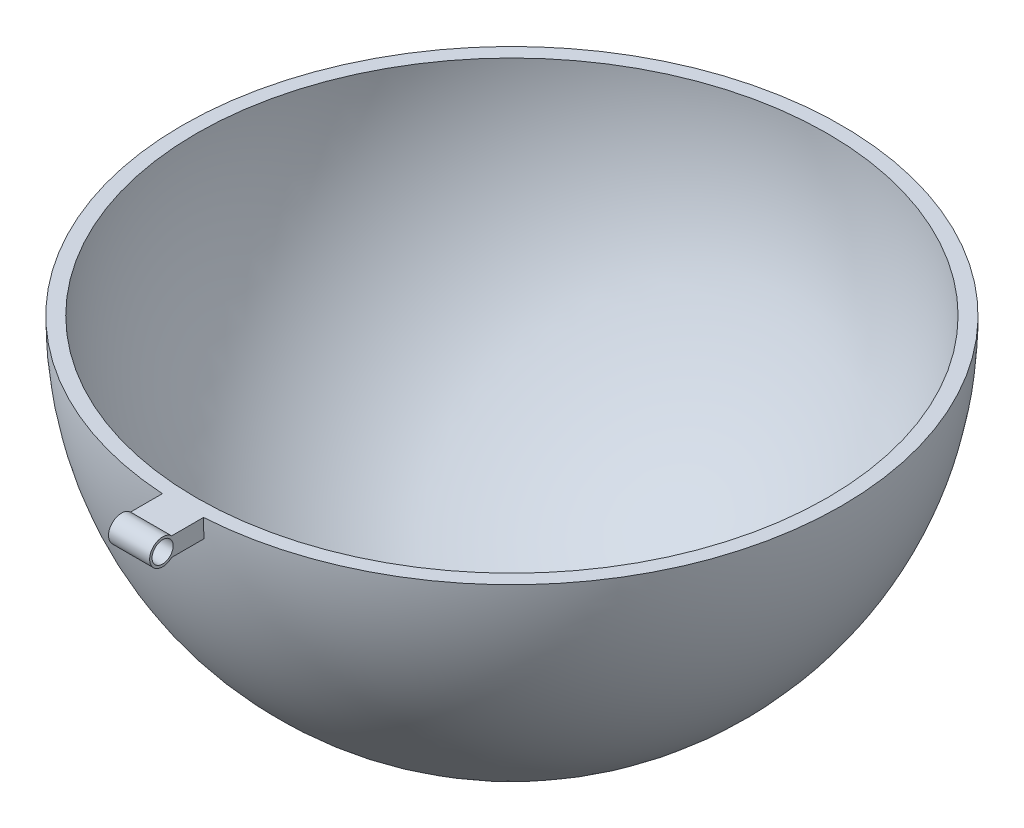
ISO-10303-21;
HEADER;
FILE_DESCRIPTION(('STEP AP214'),'2;1');
FILE_NAME('part.step','',(''),(''),'','','');
FILE_SCHEMA(('AUTOMOTIVE_DESIGN { 1 0 10303 214 1 1 1 1 }'));
ENDSEC;
DATA;
#1=APPLICATION_CONTEXT('core data for automotive mechanical design processes');
#2=APPLICATION_PROTOCOL_DEFINITION('international standard','automotive_design',2000,#1);
#3=PRODUCT_CONTEXT('',#1,'mechanical');
#4=PRODUCT('Part','Part','',(#3));
#5=PRODUCT_RELATED_PRODUCT_CATEGORY('part','',(#4));
#6=PRODUCT_DEFINITION_FORMATION('','',#4);
#7=PRODUCT_DEFINITION_CONTEXT('part definition',#1,'design');
#8=PRODUCT_DEFINITION('design','',#6,#7);
#9=PRODUCT_DEFINITION_SHAPE('','',#8);
#10=(LENGTH_UNIT() NAMED_UNIT(*) SI_UNIT(.MILLI.,.METRE.));
#11=(NAMED_UNIT(*) PLANE_ANGLE_UNIT() SI_UNIT($,.RADIAN.));
#12=(NAMED_UNIT(*) SI_UNIT($,.STERADIAN.) SOLID_ANGLE_UNIT());
#13=UNCERTAINTY_MEASURE_WITH_UNIT(LENGTH_MEASURE(1.E-05),#10,'distance_accuracy_value','');
#14=(GEOMETRIC_REPRESENTATION_CONTEXT(3) GLOBAL_UNCERTAINTY_ASSIGNED_CONTEXT((#13)) GLOBAL_UNIT_ASSIGNED_CONTEXT((#10,
#11,#12)) REPRESENTATION_CONTEXT('',''));
#15=CARTESIAN_POINT('',(0.,0.,0.));
#16=DIRECTION('',(0.,0.,1.));
#17=DIRECTION('',(1.,0.,0.));
#18=AXIS2_PLACEMENT_3D('',#15,#16,#17);
#19=CARTESIAN_POINT('',(0.,0.,0.));
#20=DIRECTION('',(-1.,0.,0.));
#21=DIRECTION('',(0.,0.,1.));
#22=AXIS2_PLACEMENT_3D('',#19,#20,#21);
#23=SPHERICAL_SURFACE('',#22,79.375);
#24=CARTESIAN_POINT('',(4.953,0.,0.));
#25=DIRECTION('',(1.,0.,0.));
#26=DIRECTION('',(0.,0.,-1.));
#27=AXIS2_PLACEMENT_3D('',#24,#25,#26);
#28=CIRCLE('',#27,79.2203156772302);
#29=CARTESIAN_POINT('',(4.953,-4.50836780584041,79.0919277532623));
#30=VERTEX_POINT('',#29);
#31=CARTESIAN_POINT('',(4.953,-3.25980566302915E-13,79.2203156772302));
#32=VERTEX_POINT('',#31);
#33=EDGE_CURVE('E80',#30,#32,#28,.F.);
#34=ORIENTED_EDGE('',*,*,#33,.F.);
#35=CARTESIAN_POINT('',(0.,-4.5083678058404,0.));
#36=DIRECTION('',(0.,1.,0.));
#37=DIRECTION('',(0.,0.,1.));
#38=AXIS2_PLACEMENT_3D('',#35,#36,#37);
#39=CIRCLE('',#38,79.2468626806592);
#40=CARTESIAN_POINT('',(-4.953,-4.50836780584041,79.0919277532623));
#41=VERTEX_POINT('',#40);
#42=EDGE_CURVE('E11',#30,#41,#39,.F.);
#43=ORIENTED_EDGE('',*,*,#42,.T.);
#44=CARTESIAN_POINT('',(-4.953,0.,0.));
#45=DIRECTION('',(1.,0.,0.));
#46=DIRECTION('',(0.,0.,-1.));
#47=AXIS2_PLACEMENT_3D('',#44,#45,#46);
#48=CIRCLE('',#47,79.2203156772302);
#49=CARTESIAN_POINT('',(-4.953,-3.25980566302915E-13,79.2203156772302));
#50=VERTEX_POINT('',#49);
#51=EDGE_CURVE('E92',#41,#50,#48,.F.);
#52=ORIENTED_EDGE('',*,*,#51,.T.);
#53=CARTESIAN_POINT('',(0.,0.,0.));
#54=DIRECTION('',(0.,-1.,0.));
#55=DIRECTION('',(0.,0.,-1.));
#56=AXIS2_PLACEMENT_3D('',#53,#54,#55);
#57=CIRCLE('',#56,79.375);
#58=EDGE_CURVE('E110',#50,#32,#57,.T.);
#59=ORIENTED_EDGE('',*,*,#58,.T.);
#60=EDGE_LOOP('',(#34,#43,#52,#59));
#61=FACE_BOUND('',#60,.T.);
#62=ADVANCED_FACE('F33',(#61),#23,.T.);
#63=CARTESIAN_POINT('',(0.,0.,0.));
#64=DIRECTION('',(-1.,0.,0.));
#65=DIRECTION('',(0.,0.,-1.));
#66=AXIS2_PLACEMENT_3D('',#63,#64,#65);
#67=SPHERICAL_SURFACE('',#66,75.9775973446225);
#68=CARTESIAN_POINT('',(0.,0.,0.));
#69=DIRECTION('',(0.,1.,0.));
#70=DIRECTION('',(0.,0.,-1.));
#71=AXIS2_PLACEMENT_3D('',#68,#69,#70);
#72=SPHERICAL_SURFACE('',#71,75.9775973446225);
#73=CARTESIAN_POINT('',(0.,0.,0.));
#74=DIRECTION('',(0.,1.,0.));
#75=DIRECTION('',(0.,0.,-1.));
#76=AXIS2_PLACEMENT_3D('',#73,#74,#75);
#77=CIRCLE('',#76,75.9775973446225);
#78=CARTESIAN_POINT('',(0.,5.30548726597774E-13,-75.9775973446225));
#79=VERTEX_POINT('',#78);
#80=EDGE_CURVE('E41',#79,#79,#77,.T.);
#81=ORIENTED_EDGE('',*,*,#80,.T.);
#82=EDGE_LOOP('',(#81));
#83=FACE_BOUND('',#82,.T.);
#84=ADVANCED_FACE('F35',(#83),#72,.F.);
#85=CARTESIAN_POINT('',(0.,0.,0.));
#86=DIRECTION('',(0.,-1.,0.));
#87=DIRECTION('',(0.,0.,-1.));
#88=AXIS2_PLACEMENT_3D('',#85,#86,#87);
#89=PLANE('',#88);
#90=ORIENTED_EDGE('',*,*,#58,.F.);
#91=DIRECTION('',(0.,0.,1.));
#92=VECTOR('',#91,1.);
#93=CARTESIAN_POINT('',(-4.953,-4.63067064255615E-13,75.9775973446225));
#94=LINE('',#93,#92);
#95=CARTESIAN_POINT('',(-4.953,0.,86.8995973446224));
#96=VERTEX_POINT('',#95);
#97=EDGE_CURVE('E89',#50,#96,#94,.T.);
#98=ORIENTED_EDGE('',*,*,#97,.T.);
#99=DIRECTION('',(-1.,0.,0.));
#100=VECTOR('',#99,1.);
#101=CARTESIAN_POINT('',(4.953,0.,86.8995973446224));
#102=LINE('',#101,#100);
#103=CARTESIAN_POINT('',(4.953,0.,86.8995973446224));
#104=VERTEX_POINT('',#103);
#105=EDGE_CURVE('E86',#104,#96,#102,.T.);
#106=ORIENTED_EDGE('',*,*,#105,.F.);
#107=DIRECTION('',(0.,0.,1.));
#108=VECTOR('',#107,1.);
#109=CARTESIAN_POINT('',(4.953,-4.63067064255615E-13,75.9775973446225));
#110=LINE('',#109,#108);
#111=EDGE_CURVE('E72',#32,#104,#110,.T.);
#112=ORIENTED_EDGE('',*,*,#111,.F.);
#113=EDGE_LOOP('',(#90,#98,#106,#112));
#114=FACE_BOUND('',#113,.T.);
#115=ORIENTED_EDGE('',*,*,#80,.F.);
#116=EDGE_LOOP('',(#115));
#117=FACE_BOUND('',#116,.T.);
#118=ADVANCED_FACE('F87',(#114,#117),#89,.F.);
#119=CARTESIAN_POINT('',(4.953,-2.25418390292021,89.0677565006851));
#120=DIRECTION('',(1.,0.,0.));
#121=DIRECTION('',(0.,0.,-1.));
#122=AXIS2_PLACEMENT_3D('',#119,#120,#121);
#123=PLANE('',#122);
#124=DIRECTION('',(0.,0.,-1.));
#125=VECTOR('',#124,1.);
#126=CARTESIAN_POINT('',(4.953,-4.50836780584041,75.9775973446225));
#127=LINE('',#126,#125);
#128=CARTESIAN_POINT('',(4.953,-4.50836780584041,86.8995973446224));
#129=VERTEX_POINT('',#128);
#130=EDGE_CURVE('E96',#129,#30,#127,.T.);
#131=ORIENTED_EDGE('',*,*,#130,.T.);
#132=ORIENTED_EDGE('',*,*,#33,.T.);
#133=ORIENTED_EDGE('',*,*,#111,.T.);
#134=CARTESIAN_POINT('',(4.953,-2.25418390292021,89.0677565006851));
#135=DIRECTION('',(1.,0.,0.));
#136=DIRECTION('',(0.,0.,-1.));
#137=AXIS2_PLACEMENT_3D('',#134,#135,#136);
#138=CIRCLE('',#137,3.12766033868812);
#139=EDGE_CURVE('E77',#104,#129,#138,.T.);
#140=ORIENTED_EDGE('',*,*,#139,.T.);
#141=EDGE_LOOP('',(#131,#132,#133,#140));
#142=FACE_BOUND('',#141,.T.);
#143=CARTESIAN_POINT('',(4.953,-2.25418390292021,89.0677565006851));
#144=DIRECTION('',(1.,0.,0.));
#145=DIRECTION('',(0.,0.,-1.));
#146=AXIS2_PLACEMENT_3D('',#143,#144,#145);
#147=CIRCLE('',#146,2.54);
#148=CARTESIAN_POINT('',(4.953,-2.25418390292021,86.5277565006851));
#149=VERTEX_POINT('',#148);
#150=EDGE_CURVE('E103',#149,#149,#147,.T.);
#151=ORIENTED_EDGE('',*,*,#150,.F.);
#152=EDGE_LOOP('',(#151));
#153=FACE_BOUND('',#152,.T.);
#154=ADVANCED_FACE('F74',(#142,#153),#123,.T.);
#155=CARTESIAN_POINT('',(-4.953,-2.25418390292021,89.0677565006851));
#156=DIRECTION('',(1.,0.,0.));
#157=DIRECTION('',(0.,0.,-1.));
#158=AXIS2_PLACEMENT_3D('',#155,#156,#157);
#159=PLANE('',#158);
#160=ORIENTED_EDGE('',*,*,#51,.F.);
#161=DIRECTION('',(0.,0.,-1.));
#162=VECTOR('',#161,1.);
#163=CARTESIAN_POINT('',(-4.953,-4.50836780584041,75.9775973446225));
#164=LINE('',#163,#162);
#165=CARTESIAN_POINT('',(-4.953,-4.50836780584041,86.8995973446224));
#166=VERTEX_POINT('',#165);
#167=EDGE_CURVE('E48',#166,#41,#164,.T.);
#168=ORIENTED_EDGE('',*,*,#167,.F.);
#169=CARTESIAN_POINT('',(-4.953,-2.25418390292021,89.0677565006851));
#170=DIRECTION('',(1.,0.,0.));
#171=DIRECTION('',(0.,0.,-1.));
#172=AXIS2_PLACEMENT_3D('',#169,#170,#171);
#173=CIRCLE('',#172,3.12766033868812);
#174=EDGE_CURVE('E102',#96,#166,#173,.T.);
#175=ORIENTED_EDGE('',*,*,#174,.F.);
#176=ORIENTED_EDGE('',*,*,#97,.F.);
#177=EDGE_LOOP('',(#160,#168,#175,#176));
#178=FACE_BOUND('',#177,.T.);
#179=CARTESIAN_POINT('',(-4.953,-2.25418390292021,89.0677565006851));
#180=DIRECTION('',(1.,0.,0.));
#181=DIRECTION('',(0.,0.,-1.));
#182=AXIS2_PLACEMENT_3D('',#179,#180,#181);
#183=CIRCLE('',#182,2.54);
#184=CARTESIAN_POINT('',(-4.953,-2.25418390292021,86.5277565006851));
#185=VERTEX_POINT('',#184);
#186=EDGE_CURVE('E194',#185,#185,#183,.T.);
#187=ORIENTED_EDGE('',*,*,#186,.T.);
#188=EDGE_LOOP('',(#187));
#189=FACE_BOUND('',#188,.T.);
#190=ADVANCED_FACE('F120',(#178,#189),#159,.F.);
#191=CARTESIAN_POINT('',(4.953,-2.25418390292021,89.0677565006851));
#192=DIRECTION('',(-1.,0.,0.));
#193=DIRECTION('',(0.,0.,1.));
#194=AXIS2_PLACEMENT_3D('',#191,#192,#193);
#195=CYLINDRICAL_SURFACE('',#194,3.12766033868812);
#196=ORIENTED_EDGE('',*,*,#174,.T.);
#197=DIRECTION('',(-1.,0.,0.));
#198=VECTOR('',#197,1.);
#199=CARTESIAN_POINT('',(4.953,-4.50836780584041,86.8995973446224));
#200=LINE('',#199,#198);
#201=EDGE_CURVE('E93',#129,#166,#200,.T.);
#202=ORIENTED_EDGE('',*,*,#201,.F.);
#203=ORIENTED_EDGE('',*,*,#139,.F.);
#204=ORIENTED_EDGE('',*,*,#105,.T.);
#205=EDGE_LOOP('',(#196,#202,#203,#204));
#206=FACE_BOUND('',#205,.T.);
#207=ADVANCED_FACE('F95',(#206),#195,.T.);
#208=CARTESIAN_POINT('',(4.953,-4.50836780584041,75.9775973446225));
#209=DIRECTION('',(0.,1.,0.));
#210=DIRECTION('',(0.,0.,1.));
#211=AXIS2_PLACEMENT_3D('',#208,#209,#210);
#212=PLANE('',#211);
#213=ORIENTED_EDGE('',*,*,#42,.F.);
#214=ORIENTED_EDGE('',*,*,#130,.F.);
#215=ORIENTED_EDGE('',*,*,#201,.T.);
#216=ORIENTED_EDGE('',*,*,#167,.T.);
#217=EDGE_LOOP('',(#213,#214,#215,#216));
#218=FACE_BOUND('',#217,.T.);
#219=ADVANCED_FACE('F129',(#218),#212,.F.);
#220=CARTESIAN_POINT('',(4.953,-2.25418390292021,89.0677565006851));
#221=DIRECTION('',(-1.,0.,0.));
#222=DIRECTION('',(0.,0.,1.));
#223=AXIS2_PLACEMENT_3D('',#220,#221,#222);
#224=CYLINDRICAL_SURFACE('',#223,2.54);
#225=ORIENTED_EDGE('',*,*,#150,.T.);
#226=EDGE_LOOP('',(#225));
#227=FACE_BOUND('',#226,.T.);
#228=ORIENTED_EDGE('',*,*,#186,.F.);
#229=EDGE_LOOP('',(#228));
#230=FACE_BOUND('',#229,.T.);
#231=ADVANCED_FACE('F131',(#227,#230),#224,.F.);
#232=CLOSED_SHELL('',(#62,#84,#118,#154,#190,#207,#219,#231));
#233=MANIFOLD_SOLID_BREP('B2',#232);
#234=ADVANCED_BREP_SHAPE_REPRESENTATION('',(#18,#233),#14);
#235=SHAPE_DEFINITION_REPRESENTATION(#9,#234);
ENDSEC;
END-ISO-10303-21;
